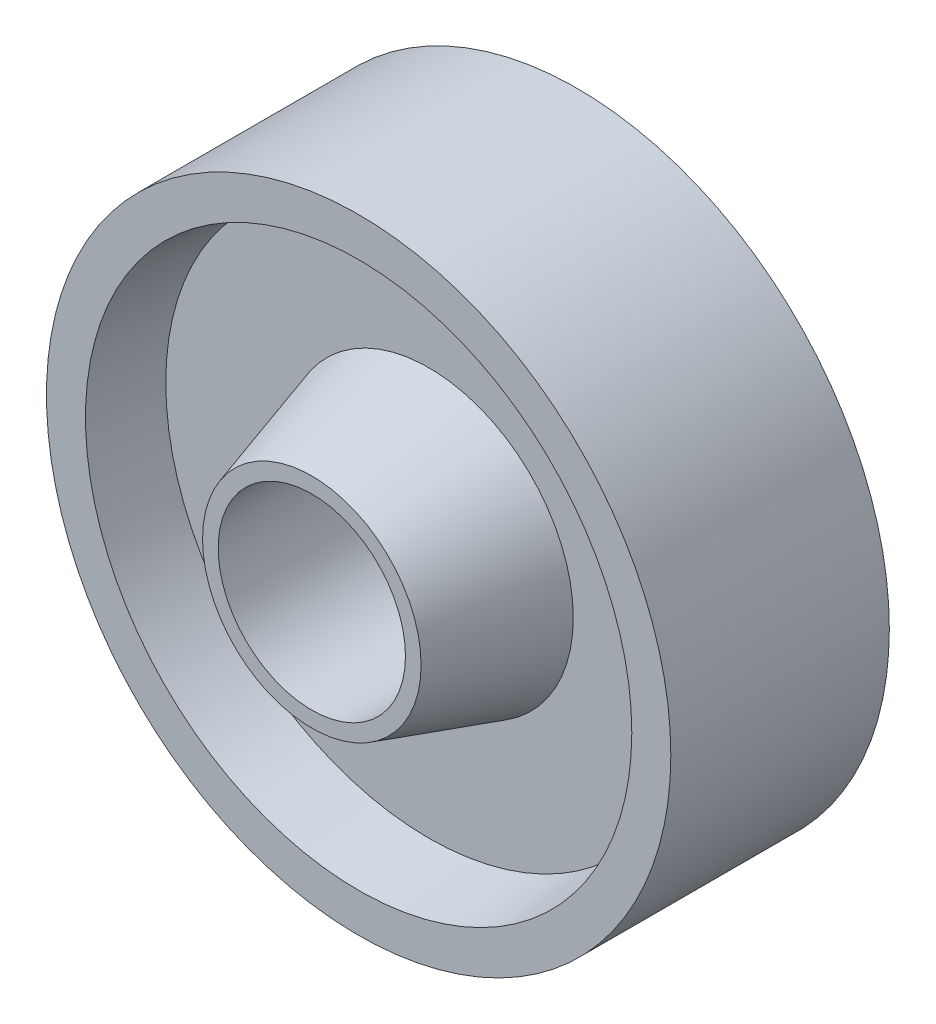
ISO-10303-21;
HEADER;
FILE_DESCRIPTION(('STEP AP214'),'2;1');
FILE_NAME('part.step','',(''),(''),'','','');
FILE_SCHEMA(('AUTOMOTIVE_DESIGN { 1 0 10303 214 1 1 1 1 }'));
ENDSEC;
DATA;
#1=APPLICATION_CONTEXT('core data for automotive mechanical design processes');
#2=APPLICATION_PROTOCOL_DEFINITION('international standard','automotive_design',2000,#1);
#3=PRODUCT_CONTEXT('',#1,'mechanical');
#4=PRODUCT('Part','Part','',(#3));
#5=PRODUCT_RELATED_PRODUCT_CATEGORY('part','',(#4));
#6=PRODUCT_DEFINITION_FORMATION('','',#4);
#7=PRODUCT_DEFINITION_CONTEXT('part definition',#1,'design');
#8=PRODUCT_DEFINITION('design','',#6,#7);
#9=PRODUCT_DEFINITION_SHAPE('','',#8);
#10=(LENGTH_UNIT() NAMED_UNIT(*) SI_UNIT(.MILLI.,.METRE.));
#11=(NAMED_UNIT(*) PLANE_ANGLE_UNIT() SI_UNIT($,.RADIAN.));
#12=(NAMED_UNIT(*) SI_UNIT($,.STERADIAN.) SOLID_ANGLE_UNIT());
#13=UNCERTAINTY_MEASURE_WITH_UNIT(LENGTH_MEASURE(1.E-05),#10,'distance_accuracy_value','');
#14=(GEOMETRIC_REPRESENTATION_CONTEXT(3) GLOBAL_UNCERTAINTY_ASSIGNED_CONTEXT((#13)) GLOBAL_UNIT_ASSIGNED_CONTEXT((#10,
#11,#12)) REPRESENTATION_CONTEXT('',''));
#15=CARTESIAN_POINT('',(0.,0.,0.));
#16=DIRECTION('',(0.,0.,1.));
#17=DIRECTION('',(1.,0.,0.));
#18=AXIS2_PLACEMENT_3D('',#15,#16,#17);
#19=CARTESIAN_POINT('',(0.,0.,5.));
#20=DIRECTION('',(0.,0.,1.));
#21=DIRECTION('',(1.,0.,0.));
#22=AXIS2_PLACEMENT_3D('',#19,#20,#21);
#23=PLANE('',#22);
#24=CARTESIAN_POINT('',(0.,0.,5.));
#25=DIRECTION('',(0.,0.,1.));
#26=DIRECTION('',(1.,0.,0.));
#27=AXIS2_PLACEMENT_3D('',#24,#25,#26);
#28=CIRCLE('',#27,33.7142857142857);
#29=CARTESIAN_POINT('',(33.7142857142857,0.,5.));
#30=VERTEX_POINT('',#29);
#31=EDGE_CURVE('E74',#30,#30,#28,.T.);
#32=ORIENTED_EDGE('',*,*,#31,.T.);
#33=EDGE_LOOP('',(#32));
#34=FACE_BOUND('',#33,.T.);
#35=CARTESIAN_POINT('',(0.,0.,5.));
#36=DIRECTION('',(0.,0.,1.));
#37=DIRECTION('',(1.,0.,0.));
#38=AXIS2_PLACEMENT_3D('',#35,#36,#37);
#39=CIRCLE('',#38,18.5);
#40=CARTESIAN_POINT('',(18.5,0.,5.));
#41=VERTEX_POINT('',#40);
#42=EDGE_CURVE('E10',#41,#41,#39,.T.);
#43=ORIENTED_EDGE('',*,*,#42,.F.);
#44=EDGE_LOOP('',(#43));
#45=FACE_BOUND('',#44,.T.);
#46=ADVANCED_FACE('F34',(#34,#45),#23,.T.);
#47=CARTESIAN_POINT('',(0.,0.,5.));
#48=DIRECTION('',(0.,0.,-1.));
#49=DIRECTION('',(-1.,0.,0.));
#50=AXIS2_PLACEMENT_3D('',#47,#48,#49);
#51=CONICAL_SURFACE('',#50,18.5,0.291456794477867);
#52=CARTESIAN_POINT('',(0.,0.,20.));
#53=DIRECTION('',(0.,0.,1.));
#54=DIRECTION('',(1.,0.,0.));
#55=AXIS2_PLACEMENT_3D('',#52,#53,#54);
#56=CIRCLE('',#55,14.);
#57=CARTESIAN_POINT('',(14.,0.,20.));
#58=VERTEX_POINT('',#57);
#59=EDGE_CURVE('E40',#58,#58,#56,.T.);
#60=ORIENTED_EDGE('',*,*,#59,.F.);
#61=EDGE_LOOP('',(#60));
#62=FACE_BOUND('',#61,.T.);
#63=ORIENTED_EDGE('',*,*,#42,.T.);
#64=EDGE_LOOP('',(#63));
#65=FACE_BOUND('',#64,.T.);
#66=ADVANCED_FACE('F104',(#62,#65),#51,.T.);
#67=CARTESIAN_POINT('',(0.,0.,20.));
#68=DIRECTION('',(0.,0.,1.));
#69=DIRECTION('',(1.,0.,0.));
#70=AXIS2_PLACEMENT_3D('',#67,#68,#69);
#71=PLANE('',#70);
#72=ORIENTED_EDGE('',*,*,#59,.T.);
#73=EDGE_LOOP('',(#72));
#74=FACE_BOUND('',#73,.T.);
#75=CARTESIAN_POINT('',(0.,0.,20.));
#76=DIRECTION('',(0.,0.,1.));
#77=DIRECTION('',(1.,0.,0.));
#78=AXIS2_PLACEMENT_3D('',#75,#76,#77);
#79=CIRCLE('',#78,12.);
#80=CARTESIAN_POINT('',(12.,0.,20.));
#81=VERTEX_POINT('',#80);
#82=EDGE_CURVE('E44',#81,#81,#79,.T.);
#83=ORIENTED_EDGE('',*,*,#82,.F.);
#84=EDGE_LOOP('',(#83));
#85=FACE_BOUND('',#84,.T.);
#86=ADVANCED_FACE('F108',(#74,#85),#71,.T.);
#87=CARTESIAN_POINT('',(0.,0.,0.));
#88=DIRECTION('',(0.,0.,1.));
#89=DIRECTION('',(1.,0.,0.));
#90=AXIS2_PLACEMENT_3D('',#87,#88,#89);
#91=CYLINDRICAL_SURFACE('',#90,12.);
#92=CARTESIAN_POINT('',(0.,0.,-20.));
#93=DIRECTION('',(0.,0.,1.));
#94=DIRECTION('',(1.,0.,0.));
#95=AXIS2_PLACEMENT_3D('',#92,#93,#94);
#96=CIRCLE('',#95,12.);
#97=CARTESIAN_POINT('',(12.,0.,-20.));
#98=VERTEX_POINT('',#97);
#99=EDGE_CURVE('E48',#98,#98,#96,.T.);
#100=ORIENTED_EDGE('',*,*,#99,.F.);
#101=EDGE_LOOP('',(#100));
#102=FACE_BOUND('',#101,.T.);
#103=ORIENTED_EDGE('',*,*,#82,.T.);
#104=EDGE_LOOP('',(#103));
#105=FACE_BOUND('',#104,.T.);
#106=ADVANCED_FACE('F113',(#102,#105),#91,.F.);
#107=CARTESIAN_POINT('',(0.,0.,-20.));
#108=DIRECTION('',(0.,0.,1.));
#109=DIRECTION('',(1.,0.,0.));
#110=AXIS2_PLACEMENT_3D('',#107,#108,#109);
#111=PLANE('',#110);
#112=CARTESIAN_POINT('',(0.,0.,-20.));
#113=DIRECTION('',(0.,0.,1.));
#114=DIRECTION('',(1.,0.,0.));
#115=AXIS2_PLACEMENT_3D('',#112,#113,#114);
#116=CIRCLE('',#115,14.);
#117=CARTESIAN_POINT('',(14.,0.,-20.));
#118=VERTEX_POINT('',#117);
#119=EDGE_CURVE('E53',#118,#118,#116,.T.);
#120=ORIENTED_EDGE('',*,*,#119,.F.);
#121=EDGE_LOOP('',(#120));
#122=FACE_BOUND('',#121,.T.);
#123=ORIENTED_EDGE('',*,*,#99,.T.);
#124=EDGE_LOOP('',(#123));
#125=FACE_BOUND('',#124,.T.);
#126=ADVANCED_FACE('F118',(#122,#125),#111,.F.);
#127=CARTESIAN_POINT('',(0.,0.,-5.));
#128=DIRECTION('',(0.,0.,1.));
#129=DIRECTION('',(1.,0.,0.));
#130=AXIS2_PLACEMENT_3D('',#127,#128,#129);
#131=CONICAL_SURFACE('',#130,18.5,0.291456794477867);
#132=ORIENTED_EDGE('',*,*,#119,.T.);
#133=EDGE_LOOP('',(#132));
#134=FACE_BOUND('',#133,.T.);
#135=CARTESIAN_POINT('',(0.,0.,-5.));
#136=DIRECTION('',(0.,0.,1.));
#137=DIRECTION('',(1.,0.,0.));
#138=AXIS2_PLACEMENT_3D('',#135,#136,#137);
#139=CIRCLE('',#138,18.5);
#140=CARTESIAN_POINT('',(18.5,0.,-5.));
#141=VERTEX_POINT('',#140);
#142=EDGE_CURVE('E56',#141,#141,#139,.T.);
#143=ORIENTED_EDGE('',*,*,#142,.F.);
#144=EDGE_LOOP('',(#143));
#145=FACE_BOUND('',#144,.T.);
#146=ADVANCED_FACE('F122',(#134,#145),#131,.T.);
#147=CARTESIAN_POINT('',(0.,0.,-5.));
#148=DIRECTION('',(0.,0.,1.));
#149=DIRECTION('',(1.,0.,0.));
#150=AXIS2_PLACEMENT_3D('',#147,#148,#149);
#151=PLANE('',#150);
#152=CARTESIAN_POINT('',(0.,0.,-5.));
#153=DIRECTION('',(0.,0.,1.));
#154=DIRECTION('',(1.,0.,0.));
#155=AXIS2_PLACEMENT_3D('',#152,#153,#154);
#156=CIRCLE('',#155,33.7142857142857);
#157=CARTESIAN_POINT('',(33.7142857142857,0.,-5.));
#158=VERTEX_POINT('',#157);
#159=EDGE_CURVE('E59',#158,#158,#156,.T.);
#160=ORIENTED_EDGE('',*,*,#159,.F.);
#161=EDGE_LOOP('',(#160));
#162=FACE_BOUND('',#161,.T.);
#163=ORIENTED_EDGE('',*,*,#142,.T.);
#164=EDGE_LOOP('',(#163));
#165=FACE_BOUND('',#164,.T.);
#166=ADVANCED_FACE('F126',(#162,#165),#151,.F.);
#167=CARTESIAN_POINT('',(0.,0.,-14.));
#168=DIRECTION('',(0.,0.,-1.));
#169=DIRECTION('',(-1.,0.,0.));
#170=AXIS2_PLACEMENT_3D('',#167,#168,#169);
#171=CONICAL_SURFACE('',#170,35.,0.141897054604162);
#172=ORIENTED_EDGE('',*,*,#159,.T.);
#173=EDGE_LOOP('',(#172));
#174=FACE_BOUND('',#173,.T.);
#175=CARTESIAN_POINT('',(0.,0.,-14.));
#176=DIRECTION('',(0.,0.,1.));
#177=DIRECTION('',(1.,0.,0.));
#178=AXIS2_PLACEMENT_3D('',#175,#176,#177);
#179=CIRCLE('',#178,35.);
#180=CARTESIAN_POINT('',(35.,0.,-14.));
#181=VERTEX_POINT('',#180);
#182=EDGE_CURVE('E62',#181,#181,#179,.T.);
#183=ORIENTED_EDGE('',*,*,#182,.F.);
#184=EDGE_LOOP('',(#183));
#185=FACE_BOUND('',#184,.T.);
#186=ADVANCED_FACE('F100',(#174,#185),#171,.F.);
#187=CARTESIAN_POINT('',(0.,0.,-14.));
#188=DIRECTION('',(0.,0.,-1.));
#189=DIRECTION('',(-1.,0.,0.));
#190=AXIS2_PLACEMENT_3D('',#187,#188,#189);
#191=PLANE('',#190);
#192=ORIENTED_EDGE('',*,*,#182,.T.);
#193=EDGE_LOOP('',(#192));
#194=FACE_BOUND('',#193,.T.);
#195=CARTESIAN_POINT('',(0.,0.,-14.));
#196=DIRECTION('',(0.,0.,1.));
#197=DIRECTION('',(1.,0.,0.));
#198=AXIS2_PLACEMENT_3D('',#195,#196,#197);
#199=CIRCLE('',#198,40.);
#200=CARTESIAN_POINT('',(40.,0.,-14.));
#201=VERTEX_POINT('',#200);
#202=EDGE_CURVE('E65',#201,#201,#199,.T.);
#203=ORIENTED_EDGE('',*,*,#202,.F.);
#204=EDGE_LOOP('',(#203));
#205=FACE_BOUND('',#204,.T.);
#206=ADVANCED_FACE('F94',(#194,#205),#191,.T.);
#207=CARTESIAN_POINT('',(0.,0.,0.));
#208=DIRECTION('',(0.,0.,1.));
#209=DIRECTION('',(1.,0.,0.));
#210=AXIS2_PLACEMENT_3D('',#207,#208,#209);
#211=CYLINDRICAL_SURFACE('',#210,40.);
#212=ORIENTED_EDGE('',*,*,#202,.T.);
#213=EDGE_LOOP('',(#212));
#214=FACE_BOUND('',#213,.T.);
#215=CARTESIAN_POINT('',(0.,0.,14.));
#216=DIRECTION('',(0.,0.,1.));
#217=DIRECTION('',(1.,0.,0.));
#218=AXIS2_PLACEMENT_3D('',#215,#216,#217);
#219=CIRCLE('',#218,40.);
#220=CARTESIAN_POINT('',(40.,0.,14.));
#221=VERTEX_POINT('',#220);
#222=EDGE_CURVE('E68',#221,#221,#219,.T.);
#223=ORIENTED_EDGE('',*,*,#222,.F.);
#224=EDGE_LOOP('',(#223));
#225=FACE_BOUND('',#224,.T.);
#226=ADVANCED_FACE('F89',(#214,#225),#211,.T.);
#227=CARTESIAN_POINT('',(0.,0.,14.));
#228=DIRECTION('',(0.,0.,-1.));
#229=DIRECTION('',(-1.,0.,0.));
#230=AXIS2_PLACEMENT_3D('',#227,#228,#229);
#231=PLANE('',#230);
#232=CARTESIAN_POINT('',(0.,0.,14.));
#233=DIRECTION('',(0.,0.,1.));
#234=DIRECTION('',(1.,0.,0.));
#235=AXIS2_PLACEMENT_3D('',#232,#233,#234);
#236=CIRCLE('',#235,35.);
#237=CARTESIAN_POINT('',(35.,0.,14.));
#238=VERTEX_POINT('',#237);
#239=EDGE_CURVE('E71',#238,#238,#236,.T.);
#240=ORIENTED_EDGE('',*,*,#239,.F.);
#241=EDGE_LOOP('',(#240));
#242=FACE_BOUND('',#241,.T.);
#243=ORIENTED_EDGE('',*,*,#222,.T.);
#244=EDGE_LOOP('',(#243));
#245=FACE_BOUND('',#244,.T.);
#246=ADVANCED_FACE('F83',(#242,#245),#231,.F.);
#247=CARTESIAN_POINT('',(0.,0.,14.));
#248=DIRECTION('',(0.,0.,1.));
#249=DIRECTION('',(1.,0.,0.));
#250=AXIS2_PLACEMENT_3D('',#247,#248,#249);
#251=CONICAL_SURFACE('',#250,35.,0.141897054604164);
#252=ORIENTED_EDGE('',*,*,#31,.F.);
#253=EDGE_LOOP('',(#252));
#254=FACE_BOUND('',#253,.T.);
#255=ORIENTED_EDGE('',*,*,#239,.T.);
#256=EDGE_LOOP('',(#255));
#257=FACE_BOUND('',#256,.T.);
#258=ADVANCED_FACE('F80',(#254,#257),#251,.F.);
#259=CLOSED_SHELL('',(#46,#66,#86,#106,#126,#146,#166,#186,#206,#226,#246,#258));
#260=MANIFOLD_SOLID_BREP('B2',#259);
#261=ADVANCED_BREP_SHAPE_REPRESENTATION('',(#18,#260),#14);
#262=SHAPE_DEFINITION_REPRESENTATION(#9,#261);
ENDSEC;
END-ISO-10303-21;
